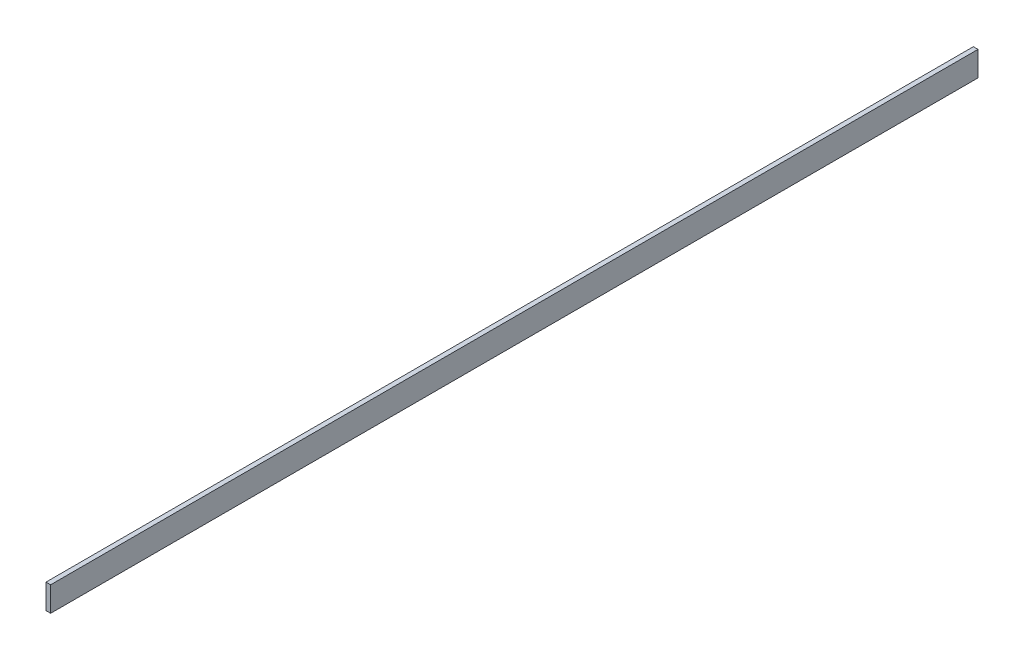
ISO-10303-21;
HEADER;
FILE_DESCRIPTION(('STEP AP214'),'2;1');
FILE_NAME('part.step','',(''),(''),'','','');
FILE_SCHEMA(('AUTOMOTIVE_DESIGN { 1 0 10303 214 1 1 1 1 }'));
ENDSEC;
DATA;
#1=APPLICATION_CONTEXT('core data for automotive mechanical design processes');
#2=APPLICATION_PROTOCOL_DEFINITION('international standard','automotive_design',2000,#1);
#3=PRODUCT_CONTEXT('',#1,'mechanical');
#4=PRODUCT('Part','Part','',(#3));
#5=PRODUCT_RELATED_PRODUCT_CATEGORY('part','',(#4));
#6=PRODUCT_DEFINITION_FORMATION('','',#4);
#7=PRODUCT_DEFINITION_CONTEXT('part definition',#1,'design');
#8=PRODUCT_DEFINITION('design','',#6,#7);
#9=PRODUCT_DEFINITION_SHAPE('','',#8);
#10=(LENGTH_UNIT() NAMED_UNIT(*) SI_UNIT(.MILLI.,.METRE.));
#11=(NAMED_UNIT(*) PLANE_ANGLE_UNIT() SI_UNIT($,.RADIAN.));
#12=(NAMED_UNIT(*) SI_UNIT($,.STERADIAN.) SOLID_ANGLE_UNIT());
#13=UNCERTAINTY_MEASURE_WITH_UNIT(LENGTH_MEASURE(1.E-05),#10,'distance_accuracy_value','');
#14=(GEOMETRIC_REPRESENTATION_CONTEXT(3) GLOBAL_UNCERTAINTY_ASSIGNED_CONTEXT((#13)) GLOBAL_UNIT_ASSIGNED_CONTEXT((#10,
#11,#12)) REPRESENTATION_CONTEXT('',''));
#15=CARTESIAN_POINT('',(0.,0.,0.));
#16=DIRECTION('',(0.,0.,1.));
#17=DIRECTION('',(1.,0.,0.));
#18=AXIS2_PLACEMENT_3D('',#15,#16,#17);
#19=CARTESIAN_POINT('',(0.,0.,600.));
#20=DIRECTION('',(1.,0.,0.));
#21=DIRECTION('',(0.,0.,-1.));
#22=AXIS2_PLACEMENT_3D('',#19,#20,#21);
#23=PLANE('',#22);
#24=DIRECTION('',(0.,-1.,0.));
#25=VECTOR('',#24,1.);
#26=CARTESIAN_POINT('',(0.,0.,0.));
#27=LINE('',#26,#25);
#28=CARTESIAN_POINT('',(0.,16.,0.));
#29=VERTEX_POINT('',#28);
#30=CARTESIAN_POINT('',(0.,0.,0.));
#31=VERTEX_POINT('',#30);
#32=EDGE_CURVE('E97',#29,#31,#27,.T.);
#33=ORIENTED_EDGE('',*,*,#32,.T.);
#34=DIRECTION('',(0.,0.,-1.));
#35=VECTOR('',#34,1.);
#36=CARTESIAN_POINT('',(0.,0.,600.));
#37=LINE('',#36,#35);
#38=CARTESIAN_POINT('',(0.,0.,600.));
#39=VERTEX_POINT('',#38);
#40=EDGE_CURVE('E11',#39,#31,#37,.T.);
#41=ORIENTED_EDGE('',*,*,#40,.F.);
#42=DIRECTION('',(0.,-1.,0.));
#43=VECTOR('',#42,1.);
#44=CARTESIAN_POINT('',(0.,0.,600.));
#45=LINE('',#44,#43);
#46=CARTESIAN_POINT('',(0.,16.,600.));
#47=VERTEX_POINT('',#46);
#48=EDGE_CURVE('E85',#47,#39,#45,.T.);
#49=ORIENTED_EDGE('',*,*,#48,.F.);
#50=DIRECTION('',(0.,0.,-1.));
#51=VECTOR('',#50,1.);
#52=CARTESIAN_POINT('',(0.,16.,600.));
#53=LINE('',#52,#51);
#54=EDGE_CURVE('E93',#47,#29,#53,.T.);
#55=ORIENTED_EDGE('',*,*,#54,.T.);
#56=EDGE_LOOP('',(#33,#41,#49,#55));
#57=FACE_BOUND('',#56,.T.);
#58=ADVANCED_FACE('F34',(#57),#23,.F.);
#59=CARTESIAN_POINT('',(0.,0.,600.));
#60=DIRECTION('',(0.,1.,0.));
#61=DIRECTION('',(0.,0.,1.));
#62=AXIS2_PLACEMENT_3D('',#59,#60,#61);
#63=PLANE('',#62);
#64=DIRECTION('',(1.,0.,0.));
#65=VECTOR('',#64,1.);
#66=CARTESIAN_POINT('',(0.,0.,0.));
#67=LINE('',#66,#65);
#68=CARTESIAN_POINT('',(3.,0.,0.));
#69=VERTEX_POINT('',#68);
#70=EDGE_CURVE('E89',#31,#69,#67,.T.);
#71=ORIENTED_EDGE('',*,*,#70,.T.);
#72=DIRECTION('',(0.,0.,-1.));
#73=VECTOR('',#72,1.);
#74=CARTESIAN_POINT('',(3.,0.,600.));
#75=LINE('',#74,#73);
#76=CARTESIAN_POINT('',(3.,0.,600.));
#77=VERTEX_POINT('',#76);
#78=EDGE_CURVE('E42',#77,#69,#75,.T.);
#79=ORIENTED_EDGE('',*,*,#78,.F.);
#80=DIRECTION('',(1.,0.,0.));
#81=VECTOR('',#80,1.);
#82=CARTESIAN_POINT('',(0.,0.,600.));
#83=LINE('',#82,#81);
#84=EDGE_CURVE('E80',#39,#77,#83,.T.);
#85=ORIENTED_EDGE('',*,*,#84,.F.);
#86=ORIENTED_EDGE('',*,*,#40,.T.);
#87=EDGE_LOOP('',(#71,#79,#85,#86));
#88=FACE_BOUND('',#87,.T.);
#89=ADVANCED_FACE('F88',(#88),#63,.F.);
#90=CARTESIAN_POINT('',(3.,0.,600.));
#91=DIRECTION('',(-1.,0.,0.));
#92=DIRECTION('',(0.,0.,1.));
#93=AXIS2_PLACEMENT_3D('',#90,#91,#92);
#94=PLANE('',#93);
#95=DIRECTION('',(0.,1.,0.));
#96=VECTOR('',#95,1.);
#97=CARTESIAN_POINT('',(3.,0.,0.));
#98=LINE('',#97,#96);
#99=CARTESIAN_POINT('',(3.,16.,0.));
#100=VERTEX_POINT('',#99);
#101=EDGE_CURVE('E67',#69,#100,#98,.T.);
#102=ORIENTED_EDGE('',*,*,#101,.T.);
#103=DIRECTION('',(0.,0.,-1.));
#104=VECTOR('',#103,1.);
#105=CARTESIAN_POINT('',(3.,16.,600.));
#106=LINE('',#105,#104);
#107=CARTESIAN_POINT('',(3.,16.,600.));
#108=VERTEX_POINT('',#107);
#109=EDGE_CURVE('E90',#108,#100,#106,.T.);
#110=ORIENTED_EDGE('',*,*,#109,.F.);
#111=DIRECTION('',(0.,1.,0.));
#112=VECTOR('',#111,1.);
#113=CARTESIAN_POINT('',(3.,0.,600.));
#114=LINE('',#113,#112);
#115=EDGE_CURVE('E83',#77,#108,#114,.T.);
#116=ORIENTED_EDGE('',*,*,#115,.F.);
#117=ORIENTED_EDGE('',*,*,#78,.T.);
#118=EDGE_LOOP('',(#102,#110,#116,#117));
#119=FACE_BOUND('',#118,.T.);
#120=ADVANCED_FACE('F91',(#119),#94,.F.);
#121=CARTESIAN_POINT('',(0.,16.,600.));
#122=DIRECTION('',(0.,-1.,0.));
#123=DIRECTION('',(0.,0.,-1.));
#124=AXIS2_PLACEMENT_3D('',#121,#122,#123);
#125=PLANE('',#124);
#126=DIRECTION('',(-1.,0.,0.));
#127=VECTOR('',#126,1.);
#128=CARTESIAN_POINT('',(0.,16.,0.));
#129=LINE('',#128,#127);
#130=EDGE_CURVE('E73',#100,#29,#129,.T.);
#131=ORIENTED_EDGE('',*,*,#130,.T.);
#132=ORIENTED_EDGE('',*,*,#54,.F.);
#133=DIRECTION('',(-1.,0.,0.));
#134=VECTOR('',#133,1.);
#135=CARTESIAN_POINT('',(0.,16.,600.));
#136=LINE('',#135,#134);
#137=EDGE_CURVE('E50',#108,#47,#136,.T.);
#138=ORIENTED_EDGE('',*,*,#137,.F.);
#139=ORIENTED_EDGE('',*,*,#109,.T.);
#140=EDGE_LOOP('',(#131,#132,#138,#139));
#141=FACE_BOUND('',#140,.T.);
#142=ADVANCED_FACE('F104',(#141),#125,.F.);
#143=CARTESIAN_POINT('',(0.,0.,600.));
#144=DIRECTION('',(0.,0.,-1.));
#145=DIRECTION('',(-1.,0.,0.));
#146=AXIS2_PLACEMENT_3D('',#143,#144,#145);
#147=PLANE('',#146);
#148=ORIENTED_EDGE('',*,*,#48,.T.);
#149=ORIENTED_EDGE('',*,*,#84,.T.);
#150=ORIENTED_EDGE('',*,*,#115,.T.);
#151=ORIENTED_EDGE('',*,*,#137,.T.);
#152=EDGE_LOOP('',(#148,#149,#150,#151));
#153=FACE_BOUND('',#152,.T.);
#154=ADVANCED_FACE('F81',(#153),#147,.F.);
#155=CARTESIAN_POINT('',(0.,0.,0.));
#156=DIRECTION('',(0.,0.,-1.));
#157=DIRECTION('',(-1.,0.,0.));
#158=AXIS2_PLACEMENT_3D('',#155,#156,#157);
#159=PLANE('',#158);
#160=ORIENTED_EDGE('',*,*,#32,.F.);
#161=ORIENTED_EDGE('',*,*,#130,.F.);
#162=ORIENTED_EDGE('',*,*,#101,.F.);
#163=ORIENTED_EDGE('',*,*,#70,.F.);
#164=EDGE_LOOP('',(#160,#161,#162,#163));
#165=FACE_BOUND('',#164,.T.);
#166=ADVANCED_FACE('F107',(#165),#159,.T.);
#167=CLOSED_SHELL('',(#58,#89,#120,#142,#154,#166));
#168=MANIFOLD_SOLID_BREP('B2',#167);
#169=ADVANCED_BREP_SHAPE_REPRESENTATION('',(#18,#168),#14);
#170=SHAPE_DEFINITION_REPRESENTATION(#9,#169);
ENDSEC;
END-ISO-10303-21;
